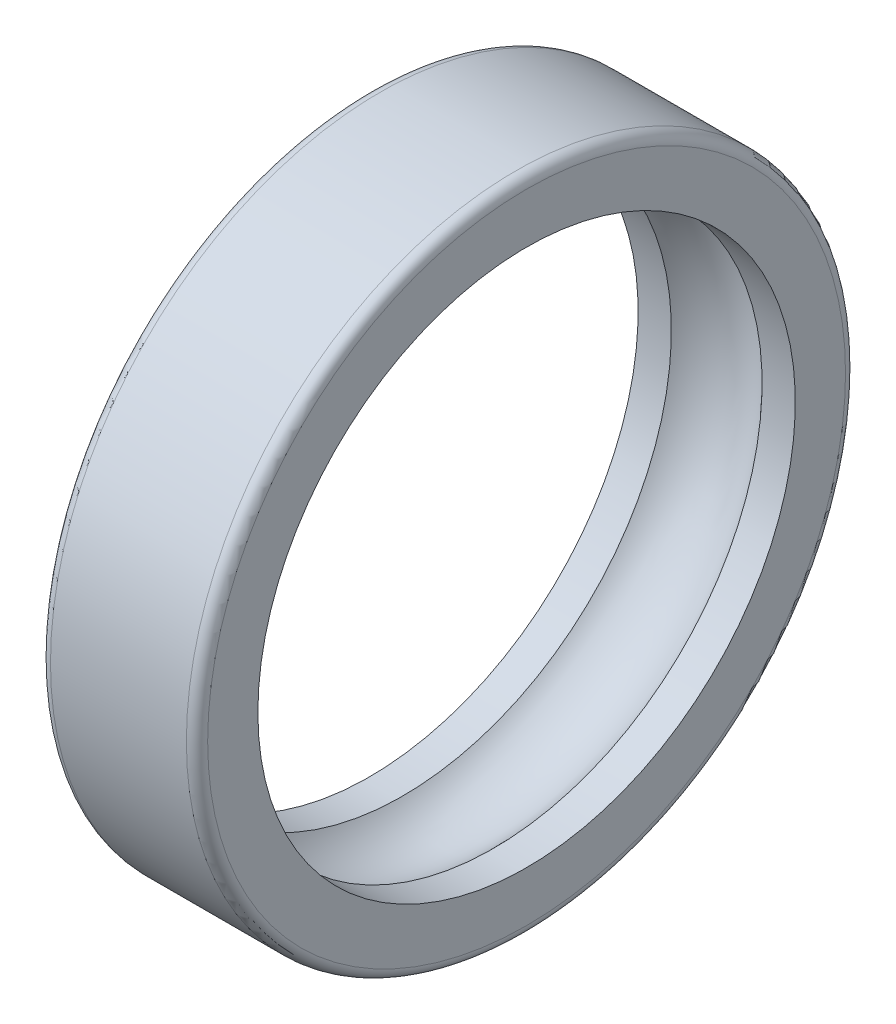
ISO-10303-21;
HEADER;
FILE_DESCRIPTION(('STEP AP214'),'2;1');
FILE_NAME('part.step','',(''),(''),'','','');
FILE_SCHEMA(('AUTOMOTIVE_DESIGN { 1 0 10303 214 1 1 1 1 }'));
ENDSEC;
DATA;
#1=APPLICATION_CONTEXT('core data for automotive mechanical design processes');
#2=APPLICATION_PROTOCOL_DEFINITION('international standard','automotive_design',2000,#1);
#3=PRODUCT_CONTEXT('',#1,'mechanical');
#4=PRODUCT('Part','Part','',(#3));
#5=PRODUCT_RELATED_PRODUCT_CATEGORY('part','',(#4));
#6=PRODUCT_DEFINITION_FORMATION('','',#4);
#7=PRODUCT_DEFINITION_CONTEXT('part definition',#1,'design');
#8=PRODUCT_DEFINITION('design','',#6,#7);
#9=PRODUCT_DEFINITION_SHAPE('','',#8);
#10=(LENGTH_UNIT() NAMED_UNIT(*) SI_UNIT(.MILLI.,.METRE.));
#11=(NAMED_UNIT(*) PLANE_ANGLE_UNIT() SI_UNIT($,.RADIAN.));
#12=(NAMED_UNIT(*) SI_UNIT($,.STERADIAN.) SOLID_ANGLE_UNIT());
#13=UNCERTAINTY_MEASURE_WITH_UNIT(LENGTH_MEASURE(1.E-05),#10,'distance_accuracy_value','');
#14=(GEOMETRIC_REPRESENTATION_CONTEXT(3) GLOBAL_UNCERTAINTY_ASSIGNED_CONTEXT((#13)) GLOBAL_UNIT_ASSIGNED_CONTEXT((#10,
#11,#12)) REPRESENTATION_CONTEXT('',''));
#15=CARTESIAN_POINT('',(0.,0.,0.));
#16=DIRECTION('',(0.,0.,1.));
#17=DIRECTION('',(1.,0.,0.));
#18=AXIS2_PLACEMENT_3D('',#15,#16,#17);
#19=CARTESIAN_POINT('',(-3.34325956297054,0.,0.));
#20=DIRECTION('',(-1.,0.,0.));
#21=DIRECTION('',(0.,0.,1.));
#22=AXIS2_PLACEMENT_3D('',#19,#20,#21);
#23=CYLINDRICAL_SURFACE('',#22,53.);
#24=CARTESIAN_POINT('',(15.5,0.,0.));
#25=DIRECTION('',(-1.,0.,0.));
#26=DIRECTION('',(0.,0.,1.));
#27=AXIS2_PLACEMENT_3D('',#24,#25,#26);
#28=CIRCLE('',#27,53.);
#29=CARTESIAN_POINT('',(15.5,0.,53.));
#30=VERTEX_POINT('',#29);
#31=EDGE_CURVE('E66',#30,#30,#28,.T.);
#32=ORIENTED_EDGE('',*,*,#31,.F.);
#33=EDGE_LOOP('',(#32));
#34=FACE_BOUND('',#33,.T.);
#35=CARTESIAN_POINT('',(8.94427190999916,0.,0.));
#36=DIRECTION('',(-1.,0.,0.));
#37=DIRECTION('',(0.,0.,1.));
#38=AXIS2_PLACEMENT_3D('',#35,#36,#37);
#39=CIRCLE('',#38,53.);
#40=CARTESIAN_POINT('',(8.94427190999916,0.,53.));
#41=VERTEX_POINT('',#40);
#42=EDGE_CURVE('E57',#41,#41,#39,.T.);
#43=ORIENTED_EDGE('',*,*,#42,.T.);
#44=EDGE_LOOP('',(#43));
#45=FACE_BOUND('',#44,.T.);
#46=ADVANCED_FACE('F37',(#34,#45),#23,.F.);
#47=CARTESIAN_POINT('',(0.,0.,0.));
#48=DIRECTION('',(-1.,0.,0.));
#49=DIRECTION('',(0.,0.,1.));
#50=AXIS2_PLACEMENT_3D('',#47,#48,#49);
#51=TOROIDAL_SURFACE('',#50,45.,12.);
#52=ORIENTED_EDGE('',*,*,#42,.F.);
#53=EDGE_LOOP('',(#52));
#54=FACE_BOUND('',#53,.T.);
#55=CARTESIAN_POINT('',(-8.94427190999916,0.,0.));
#56=DIRECTION('',(-1.,0.,0.));
#57=DIRECTION('',(0.,0.,1.));
#58=AXIS2_PLACEMENT_3D('',#55,#56,#57);
#59=CIRCLE('',#58,53.);
#60=CARTESIAN_POINT('',(-8.94427190999916,0.,53.));
#61=VERTEX_POINT('',#60);
#62=EDGE_CURVE('E60',#61,#61,#59,.T.);
#63=ORIENTED_EDGE('',*,*,#62,.T.);
#64=EDGE_LOOP('',(#63));
#65=FACE_BOUND('',#64,.T.);
#66=ADVANCED_FACE('F74',(#54,#65),#51,.F.);
#67=CARTESIAN_POINT('',(-3.34325956297054,0.,0.));
#68=DIRECTION('',(-1.,0.,0.));
#69=DIRECTION('',(0.,0.,1.));
#70=AXIS2_PLACEMENT_3D('',#67,#68,#69);
#71=CYLINDRICAL_SURFACE('',#70,53.);
#72=ORIENTED_EDGE('',*,*,#62,.F.);
#73=EDGE_LOOP('',(#72));
#74=FACE_BOUND('',#73,.T.);
#75=CARTESIAN_POINT('',(-15.5,0.,0.));
#76=DIRECTION('',(-1.,0.,0.));
#77=DIRECTION('',(0.,0.,1.));
#78=AXIS2_PLACEMENT_3D('',#75,#76,#77);
#79=CIRCLE('',#78,53.);
#80=CARTESIAN_POINT('',(-15.5,0.,53.));
#81=VERTEX_POINT('',#80);
#82=EDGE_CURVE('E63',#81,#81,#79,.T.);
#83=ORIENTED_EDGE('',*,*,#82,.T.);
#84=EDGE_LOOP('',(#83));
#85=FACE_BOUND('',#84,.T.);
#86=ADVANCED_FACE('F80',(#74,#85),#71,.F.);
#87=CARTESIAN_POINT('',(-15.5,65.,0.));
#88=DIRECTION('',(1.,0.,0.));
#89=DIRECTION('',(0.,0.,-1.));
#90=AXIS2_PLACEMENT_3D('',#87,#88,#89);
#91=PLANE('',#90);
#92=CARTESIAN_POINT('',(-15.5,0.,0.));
#93=DIRECTION('',(1.,0.,0.));
#94=DIRECTION('',(0.,0.,-1.));
#95=AXIS2_PLACEMENT_3D('',#92,#93,#94);
#96=CIRCLE('',#95,62.9);
#97=CARTESIAN_POINT('',(-15.5,0.,-62.9));
#98=VERTEX_POINT('',#97);
#99=EDGE_CURVE('E10',#98,#98,#96,.F.);
#100=ORIENTED_EDGE('',*,*,#99,.T.);
#101=EDGE_LOOP('',(#100));
#102=FACE_BOUND('',#101,.T.);
#103=ORIENTED_EDGE('',*,*,#82,.F.);
#104=EDGE_LOOP('',(#103));
#105=FACE_BOUND('',#104,.T.);
#106=ADVANCED_FACE('F86',(#102,#105),#91,.F.);
#107=CARTESIAN_POINT('',(-3.34325956297054,0.,0.));
#108=DIRECTION('',(-1.,0.,0.));
#109=DIRECTION('',(0.,0.,1.));
#110=AXIS2_PLACEMENT_3D('',#107,#108,#109);
#111=CYLINDRICAL_SURFACE('',#110,65.);
#112=CARTESIAN_POINT('',(13.4,0.,0.));
#113=DIRECTION('',(-1.,0.,0.));
#114=DIRECTION('',(0.,0.,1.));
#115=AXIS2_PLACEMENT_3D('',#112,#113,#114);
#116=CIRCLE('',#115,65.);
#117=CARTESIAN_POINT('',(13.4,0.,65.));
#118=VERTEX_POINT('',#117);
#119=EDGE_CURVE('E48',#118,#118,#116,.T.);
#120=ORIENTED_EDGE('',*,*,#119,.T.);
#121=EDGE_LOOP('',(#120));
#122=FACE_BOUND('',#121,.T.);
#123=CARTESIAN_POINT('',(-13.4,0.,0.));
#124=DIRECTION('',(1.,0.,0.));
#125=DIRECTION('',(0.,0.,-1.));
#126=AXIS2_PLACEMENT_3D('',#123,#124,#125);
#127=CIRCLE('',#126,65.);
#128=CARTESIAN_POINT('',(-13.4,0.,-65.));
#129=VERTEX_POINT('',#128);
#130=EDGE_CURVE('E52',#129,#129,#127,.T.);
#131=ORIENTED_EDGE('',*,*,#130,.T.);
#132=EDGE_LOOP('',(#131));
#133=FACE_BOUND('',#132,.T.);
#134=ADVANCED_FACE('F91',(#122,#133),#111,.T.);
#135=CARTESIAN_POINT('',(15.5,65.,0.));
#136=DIRECTION('',(-1.,0.,0.));
#137=DIRECTION('',(0.,0.,1.));
#138=AXIS2_PLACEMENT_3D('',#135,#136,#137);
#139=PLANE('',#138);
#140=CARTESIAN_POINT('',(15.5,0.,0.));
#141=DIRECTION('',(-1.,0.,0.));
#142=DIRECTION('',(0.,0.,1.));
#143=AXIS2_PLACEMENT_3D('',#140,#141,#142);
#144=CIRCLE('',#143,62.9);
#145=CARTESIAN_POINT('',(15.5,0.,62.9));
#146=VERTEX_POINT('',#145);
#147=EDGE_CURVE('E44',#146,#146,#144,.F.);
#148=ORIENTED_EDGE('',*,*,#147,.T.);
#149=EDGE_LOOP('',(#148));
#150=FACE_BOUND('',#149,.T.);
#151=ORIENTED_EDGE('',*,*,#31,.T.);
#152=EDGE_LOOP('',(#151));
#153=FACE_BOUND('',#152,.T.);
#154=ADVANCED_FACE('F70',(#150,#153),#139,.F.);
#155=CARTESIAN_POINT('',(13.4,0.,0.));
#156=DIRECTION('',(-1.,0.,0.));
#157=DIRECTION('',(0.,0.,1.));
#158=AXIS2_PLACEMENT_3D('',#155,#156,#157);
#159=TOROIDAL_SURFACE('',#158,62.9,2.1);
#160=ORIENTED_EDGE('',*,*,#147,.F.);
#161=EDGE_LOOP('',(#160));
#162=FACE_BOUND('',#161,.T.);
#163=ORIENTED_EDGE('',*,*,#119,.F.);
#164=EDGE_LOOP('',(#163));
#165=FACE_BOUND('',#164,.T.);
#166=ADVANCED_FACE('F99',(#162,#165),#159,.T.);
#167=CARTESIAN_POINT('',(-13.4,0.,0.));
#168=DIRECTION('',(1.,0.,0.));
#169=DIRECTION('',(0.,0.,-1.));
#170=AXIS2_PLACEMENT_3D('',#167,#168,#169);
#171=TOROIDAL_SURFACE('',#170,62.9,2.1);
#172=ORIENTED_EDGE('',*,*,#130,.F.);
#173=EDGE_LOOP('',(#172));
#174=FACE_BOUND('',#173,.T.);
#175=ORIENTED_EDGE('',*,*,#99,.F.);
#176=EDGE_LOOP('',(#175));
#177=FACE_BOUND('',#176,.T.);
#178=ADVANCED_FACE('F39',(#174,#177),#171,.T.);
#179=CLOSED_SHELL('',(#46,#66,#86,#106,#134,#154,#166,#178));
#180=MANIFOLD_SOLID_BREP('B2',#179);
#181=ADVANCED_BREP_SHAPE_REPRESENTATION('',(#18,#180),#14);
#182=SHAPE_DEFINITION_REPRESENTATION(#9,#181);
ENDSEC;
END-ISO-10303-21;
